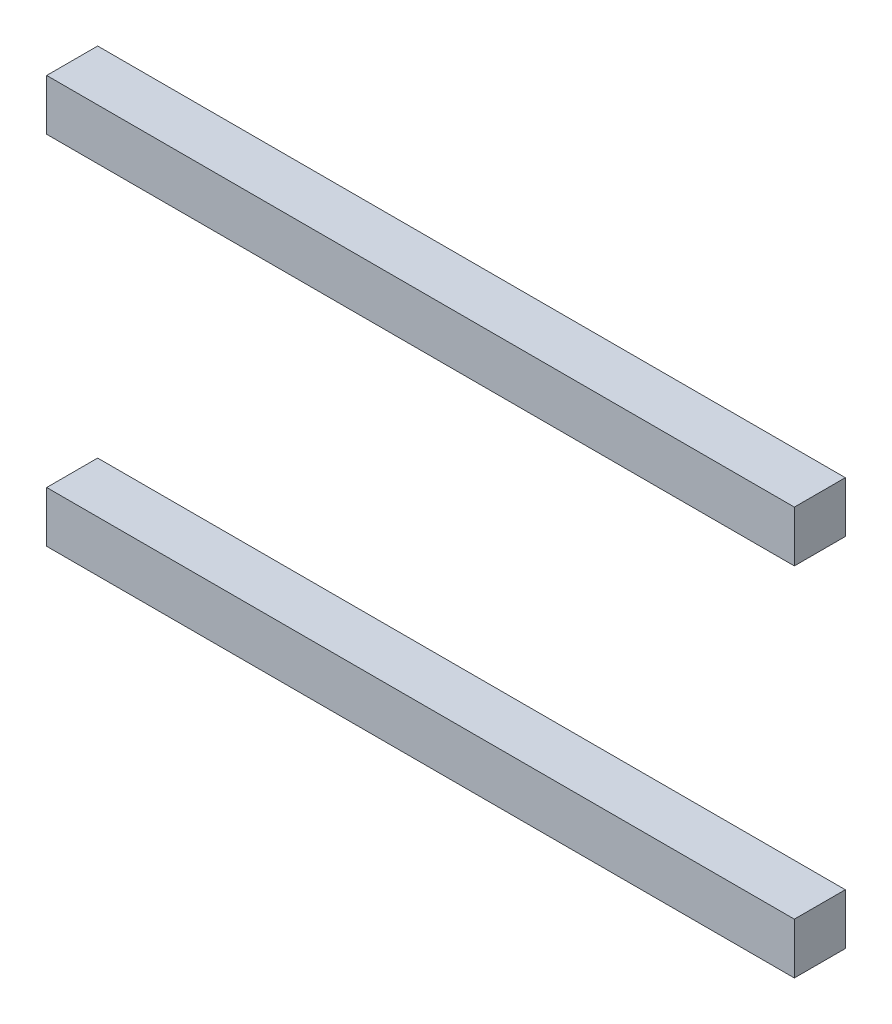
ISO-10303-21;
HEADER;
FILE_DESCRIPTION(('STEP AP214'),'2;1');
FILE_NAME('part.step','',(''),(''),'','','');
FILE_SCHEMA(('AUTOMOTIVE_DESIGN { 1 0 10303 214 1 1 1 1 }'));
ENDSEC;
DATA;
#1=APPLICATION_CONTEXT('core data for automotive mechanical design processes');
#2=APPLICATION_PROTOCOL_DEFINITION('international standard','automotive_design',2000,#1);
#3=PRODUCT_CONTEXT('',#1,'mechanical');
#4=PRODUCT('Part','Part','',(#3));
#5=PRODUCT_RELATED_PRODUCT_CATEGORY('part','',(#4));
#6=PRODUCT_DEFINITION_FORMATION('','',#4);
#7=PRODUCT_DEFINITION_CONTEXT('part definition',#1,'design');
#8=PRODUCT_DEFINITION('design','',#6,#7);
#9=PRODUCT_DEFINITION_SHAPE('','',#8);
#10=(LENGTH_UNIT() NAMED_UNIT(*) SI_UNIT(.MILLI.,.METRE.));
#11=(NAMED_UNIT(*) PLANE_ANGLE_UNIT() SI_UNIT($,.RADIAN.));
#12=(NAMED_UNIT(*) SI_UNIT($,.STERADIAN.) SOLID_ANGLE_UNIT());
#13=UNCERTAINTY_MEASURE_WITH_UNIT(LENGTH_MEASURE(1.E-05),#10,'distance_accuracy_value','');
#14=(GEOMETRIC_REPRESENTATION_CONTEXT(3) GLOBAL_UNCERTAINTY_ASSIGNED_CONTEXT((#13)) GLOBAL_UNIT_ASSIGNED_CONTEXT((#10,
#11,#12)) REPRESENTATION_CONTEXT('',''));
#15=CARTESIAN_POINT('',(0.,0.,0.));
#16=DIRECTION('',(0.,0.,1.));
#17=DIRECTION('',(1.,0.,0.));
#18=AXIS2_PLACEMENT_3D('',#15,#16,#17);
#19=CARTESIAN_POINT('',(-165.608108108108,-117.635135135135,30.));
#20=DIRECTION('',(1.,0.,0.));
#21=DIRECTION('',(0.,0.,-1.));
#22=AXIS2_PLACEMENT_3D('',#19,#20,#21);
#23=PLANE('',#22);
#24=DIRECTION('',(0.,-1.,0.));
#25=VECTOR('',#24,1.);
#26=CARTESIAN_POINT('',(-165.608108108108,-117.635135135135,0.));
#27=LINE('',#26,#25);
#28=CARTESIAN_POINT('',(-165.608108108108,-117.635135135135,0.));
#29=VERTEX_POINT('',#28);
#30=CARTESIAN_POINT('',(-165.608108108108,-147.635135135135,0.));
#31=VERTEX_POINT('',#30);
#32=EDGE_CURVE('E12',#29,#31,#27,.T.);
#33=ORIENTED_EDGE('',*,*,#32,.T.);
#34=DIRECTION('',(0.,0.,-1.));
#35=VECTOR('',#34,1.);
#36=CARTESIAN_POINT('',(-165.608108108108,-147.635135135135,30.));
#37=LINE('',#36,#35);
#38=CARTESIAN_POINT('',(-165.608108108108,-147.635135135135,30.));
#39=VERTEX_POINT('',#38);
#40=EDGE_CURVE('E133',#39,#31,#37,.T.);
#41=ORIENTED_EDGE('',*,*,#40,.F.);
#42=DIRECTION('',(0.,-1.,0.));
#43=VECTOR('',#42,1.);
#44=CARTESIAN_POINT('',(-165.608108108108,-117.635135135135,30.));
#45=LINE('',#44,#43);
#46=CARTESIAN_POINT('',(-165.608108108108,-117.635135135135,30.));
#47=VERTEX_POINT('',#46);
#48=EDGE_CURVE('E57',#47,#39,#45,.T.);
#49=ORIENTED_EDGE('',*,*,#48,.F.);
#50=DIRECTION('',(0.,0.,-1.));
#51=VECTOR('',#50,1.);
#52=CARTESIAN_POINT('',(-165.608108108108,-117.635135135135,30.));
#53=LINE('',#52,#51);
#54=EDGE_CURVE('E115',#47,#29,#53,.T.);
#55=ORIENTED_EDGE('',*,*,#54,.T.);
#56=EDGE_LOOP('',(#33,#41,#49,#55));
#57=FACE_BOUND('',#56,.T.);
#58=ADVANCED_FACE('F53',(#57),#23,.F.);
#59=CARTESIAN_POINT('',(-165.608108108108,-147.635135135135,30.));
#60=DIRECTION('',(0.,1.,0.));
#61=DIRECTION('',(0.,0.,1.));
#62=AXIS2_PLACEMENT_3D('',#59,#60,#61);
#63=PLANE('',#62);
#64=DIRECTION('',(1.,0.,0.));
#65=VECTOR('',#64,1.);
#66=CARTESIAN_POINT('',(-165.608108108108,-147.635135135135,0.));
#67=LINE('',#66,#65);
#68=CARTESIAN_POINT('',(274.391891891892,-147.635135135135,0.));
#69=VERTEX_POINT('',#68);
#70=EDGE_CURVE('E64',#31,#69,#67,.T.);
#71=ORIENTED_EDGE('',*,*,#70,.T.);
#72=DIRECTION('',(0.,0.,-1.));
#73=VECTOR('',#72,1.);
#74=CARTESIAN_POINT('',(274.391891891892,-147.635135135135,30.));
#75=LINE('',#74,#73);
#76=CARTESIAN_POINT('',(274.391891891892,-147.635135135135,30.));
#77=VERTEX_POINT('',#76);
#78=EDGE_CURVE('E109',#77,#69,#75,.T.);
#79=ORIENTED_EDGE('',*,*,#78,.F.);
#80=DIRECTION('',(1.,0.,0.));
#81=VECTOR('',#80,1.);
#82=CARTESIAN_POINT('',(-165.608108108108,-147.635135135135,30.));
#83=LINE('',#82,#81);
#84=EDGE_CURVE('E88',#39,#77,#83,.T.);
#85=ORIENTED_EDGE('',*,*,#84,.F.);
#86=ORIENTED_EDGE('',*,*,#40,.T.);
#87=EDGE_LOOP('',(#71,#79,#85,#86));
#88=FACE_BOUND('',#87,.T.);
#89=ADVANCED_FACE('F137',(#88),#63,.F.);
#90=CARTESIAN_POINT('',(274.391891891892,-117.635135135135,30.));
#91=DIRECTION('',(-1.,0.,0.));
#92=DIRECTION('',(0.,-1.,0.));
#93=AXIS2_PLACEMENT_3D('',#90,#91,#92);
#94=PLANE('',#93);
#95=DIRECTION('',(0.,1.,0.));
#96=VECTOR('',#95,1.);
#97=CARTESIAN_POINT('',(274.391891891892,-117.635135135135,0.));
#98=LINE('',#97,#96);
#99=CARTESIAN_POINT('',(274.391891891892,-117.635135135135,0.));
#100=VERTEX_POINT('',#99);
#101=EDGE_CURVE('E104',#69,#100,#98,.T.);
#102=ORIENTED_EDGE('',*,*,#101,.T.);
#103=DIRECTION('',(0.,0.,-1.));
#104=VECTOR('',#103,1.);
#105=CARTESIAN_POINT('',(274.391891891892,-117.635135135135,30.));
#106=LINE('',#105,#104);
#107=CARTESIAN_POINT('',(274.391891891892,-117.635135135135,30.));
#108=VERTEX_POINT('',#107);
#109=EDGE_CURVE('E107',#108,#100,#106,.T.);
#110=ORIENTED_EDGE('',*,*,#109,.F.);
#111=DIRECTION('',(0.,1.,0.));
#112=VECTOR('',#111,1.);
#113=CARTESIAN_POINT('',(274.391891891892,-117.635135135135,30.));
#114=LINE('',#113,#112);
#115=EDGE_CURVE('E127',#77,#108,#114,.T.);
#116=ORIENTED_EDGE('',*,*,#115,.F.);
#117=ORIENTED_EDGE('',*,*,#78,.T.);
#118=EDGE_LOOP('',(#102,#110,#116,#117));
#119=FACE_BOUND('',#118,.T.);
#120=ADVANCED_FACE('F105',(#119),#94,.F.);
#121=CARTESIAN_POINT('',(-165.608108108108,-117.635135135135,30.));
#122=DIRECTION('',(0.,-1.,0.));
#123=DIRECTION('',(0.,0.,-1.));
#124=AXIS2_PLACEMENT_3D('',#121,#122,#123);
#125=PLANE('',#124);
#126=DIRECTION('',(-1.,0.,0.));
#127=VECTOR('',#126,1.);
#128=CARTESIAN_POINT('',(-165.608108108108,-117.635135135135,0.));
#129=LINE('',#128,#127);
#130=EDGE_CURVE('E98',#100,#29,#129,.T.);
#131=ORIENTED_EDGE('',*,*,#130,.T.);
#132=ORIENTED_EDGE('',*,*,#54,.F.);
#133=DIRECTION('',(-1.,0.,0.));
#134=VECTOR('',#133,1.);
#135=CARTESIAN_POINT('',(-165.608108108108,-117.635135135135,30.));
#136=LINE('',#135,#134);
#137=EDGE_CURVE('E113',#108,#47,#136,.T.);
#138=ORIENTED_EDGE('',*,*,#137,.F.);
#139=ORIENTED_EDGE('',*,*,#109,.T.);
#140=EDGE_LOOP('',(#131,#132,#138,#139));
#141=FACE_BOUND('',#140,.T.);
#142=ADVANCED_FACE('F112',(#141),#125,.F.);
#143=CARTESIAN_POINT('',(0.,0.,30.));
#144=DIRECTION('',(0.,0.,1.));
#145=DIRECTION('',(1.,0.,0.));
#146=AXIS2_PLACEMENT_3D('',#143,#144,#145);
#147=PLANE('',#146);
#148=ORIENTED_EDGE('',*,*,#48,.T.);
#149=ORIENTED_EDGE('',*,*,#84,.T.);
#150=ORIENTED_EDGE('',*,*,#115,.T.);
#151=ORIENTED_EDGE('',*,*,#137,.T.);
#152=EDGE_LOOP('',(#148,#149,#150,#151));
#153=FACE_BOUND('',#152,.T.);
#154=ADVANCED_FACE('F55',(#153),#147,.T.);
#155=CARTESIAN_POINT('',(0.,0.,0.));
#156=DIRECTION('',(0.,0.,1.));
#157=DIRECTION('',(1.,0.,0.));
#158=AXIS2_PLACEMENT_3D('',#155,#156,#157);
#159=PLANE('',#158);
#160=ORIENTED_EDGE('',*,*,#32,.F.);
#161=ORIENTED_EDGE('',*,*,#130,.F.);
#162=ORIENTED_EDGE('',*,*,#101,.F.);
#163=ORIENTED_EDGE('',*,*,#70,.F.);
#164=EDGE_LOOP('',(#160,#161,#162,#163));
#165=FACE_BOUND('',#164,.T.);
#166=ADVANCED_FACE('F117',(#165),#159,.F.);
#167=CLOSED_SHELL('',(#58,#89,#120,#142,#154,#166));
#168=MANIFOLD_SOLID_BREP('B2',#167);
#169=CARTESIAN_POINT('',(-165.608108108108,92.3648648648649,30.));
#170=DIRECTION('',(1.,0.,0.));
#171=DIRECTION('',(0.,0.,-1.));
#172=AXIS2_PLACEMENT_3D('',#169,#170,#171);
#173=PLANE('',#172);
#174=DIRECTION('',(0.,-1.,0.));
#175=VECTOR('',#174,1.);
#176=CARTESIAN_POINT('',(-165.608108108108,92.3648648648649,0.));
#177=LINE('',#176,#175);
#178=CARTESIAN_POINT('',(-165.608108108108,92.3648648648649,0.));
#179=VERTEX_POINT('',#178);
#180=CARTESIAN_POINT('',(-165.608108108108,62.3648648648648,0.));
#181=VERTEX_POINT('',#180);
#182=EDGE_CURVE('E264',#179,#181,#177,.T.);
#183=ORIENTED_EDGE('',*,*,#182,.T.);
#184=DIRECTION('',(0.,0.,-1.));
#185=VECTOR('',#184,1.);
#186=CARTESIAN_POINT('',(-165.608108108108,62.3648648648648,30.));
#187=LINE('',#186,#185);
#188=CARTESIAN_POINT('',(-165.608108108108,62.3648648648648,30.));
#189=VERTEX_POINT('',#188);
#190=EDGE_CURVE('E51',#189,#181,#187,.T.);
#191=ORIENTED_EDGE('',*,*,#190,.F.);
#192=DIRECTION('',(0.,-1.,0.));
#193=VECTOR('',#192,1.);
#194=CARTESIAN_POINT('',(-165.608108108108,92.3648648648649,30.));
#195=LINE('',#194,#193);
#196=CARTESIAN_POINT('',(-165.608108108108,92.3648648648649,30.));
#197=VERTEX_POINT('',#196);
#198=EDGE_CURVE('E252',#197,#189,#195,.T.);
#199=ORIENTED_EDGE('',*,*,#198,.F.);
#200=DIRECTION('',(0.,0.,-1.));
#201=VECTOR('',#200,1.);
#202=CARTESIAN_POINT('',(-165.608108108108,92.3648648648649,30.));
#203=LINE('',#202,#201);
#204=EDGE_CURVE('E260',#197,#179,#203,.T.);
#205=ORIENTED_EDGE('',*,*,#204,.T.);
#206=EDGE_LOOP('',(#183,#191,#199,#205));
#207=FACE_BOUND('',#206,.T.);
#208=ADVANCED_FACE('F201',(#207),#173,.F.);
#209=CARTESIAN_POINT('',(-165.608108108108,62.3648648648648,30.));
#210=DIRECTION('',(0.,1.,0.));
#211=DIRECTION('',(0.,0.,1.));
#212=AXIS2_PLACEMENT_3D('',#209,#210,#211);
#213=PLANE('',#212);
#214=DIRECTION('',(1.,0.,0.));
#215=VECTOR('',#214,1.);
#216=CARTESIAN_POINT('',(-165.608108108108,62.3648648648648,0.));
#217=LINE('',#216,#215);
#218=CARTESIAN_POINT('',(274.391891891892,62.3648648648648,0.));
#219=VERTEX_POINT('',#218);
#220=EDGE_CURVE('E256',#181,#219,#217,.T.);
#221=ORIENTED_EDGE('',*,*,#220,.T.);
#222=DIRECTION('',(0.,0.,-1.));
#223=VECTOR('',#222,1.);
#224=CARTESIAN_POINT('',(274.391891891892,62.3648648648648,30.));
#225=LINE('',#224,#223);
#226=CARTESIAN_POINT('',(274.391891891892,62.3648648648648,30.));
#227=VERTEX_POINT('',#226);
#228=EDGE_CURVE('E209',#227,#219,#225,.T.);
#229=ORIENTED_EDGE('',*,*,#228,.F.);
#230=DIRECTION('',(1.,0.,0.));
#231=VECTOR('',#230,1.);
#232=CARTESIAN_POINT('',(-165.608108108108,62.3648648648648,30.));
#233=LINE('',#232,#231);
#234=EDGE_CURVE('E247',#189,#227,#233,.T.);
#235=ORIENTED_EDGE('',*,*,#234,.F.);
#236=ORIENTED_EDGE('',*,*,#190,.T.);
#237=EDGE_LOOP('',(#221,#229,#235,#236));
#238=FACE_BOUND('',#237,.T.);
#239=ADVANCED_FACE('F255',(#238),#213,.F.);
#240=CARTESIAN_POINT('',(274.391891891892,92.3648648648649,30.));
#241=DIRECTION('',(-1.,0.,0.));
#242=DIRECTION('',(0.,0.,1.));
#243=AXIS2_PLACEMENT_3D('',#240,#241,#242);
#244=PLANE('',#243);
#245=DIRECTION('',(0.,1.,0.));
#246=VECTOR('',#245,1.);
#247=CARTESIAN_POINT('',(274.391891891892,92.3648648648649,0.));
#248=LINE('',#247,#246);
#249=CARTESIAN_POINT('',(274.391891891892,92.3648648648649,0.));
#250=VERTEX_POINT('',#249);
#251=EDGE_CURVE('E234',#219,#250,#248,.T.);
#252=ORIENTED_EDGE('',*,*,#251,.T.);
#253=DIRECTION('',(0.,0.,-1.));
#254=VECTOR('',#253,1.);
#255=CARTESIAN_POINT('',(274.391891891892,92.3648648648649,30.));
#256=LINE('',#255,#254);
#257=CARTESIAN_POINT('',(274.391891891892,92.3648648648649,30.));
#258=VERTEX_POINT('',#257);
#259=EDGE_CURVE('E257',#258,#250,#256,.T.);
#260=ORIENTED_EDGE('',*,*,#259,.F.);
#261=DIRECTION('',(0.,1.,0.));
#262=VECTOR('',#261,1.);
#263=CARTESIAN_POINT('',(274.391891891892,92.3648648648649,30.));
#264=LINE('',#263,#262);
#265=EDGE_CURVE('E250',#227,#258,#264,.T.);
#266=ORIENTED_EDGE('',*,*,#265,.F.);
#267=ORIENTED_EDGE('',*,*,#228,.T.);
#268=EDGE_LOOP('',(#252,#260,#266,#267));
#269=FACE_BOUND('',#268,.T.);
#270=ADVANCED_FACE('F258',(#269),#244,.F.);
#271=CARTESIAN_POINT('',(-165.608108108108,92.3648648648649,30.));
#272=DIRECTION('',(0.,-1.,0.));
#273=DIRECTION('',(0.,0.,-1.));
#274=AXIS2_PLACEMENT_3D('',#271,#272,#273);
#275=PLANE('',#274);
#276=DIRECTION('',(-1.,0.,0.));
#277=VECTOR('',#276,1.);
#278=CARTESIAN_POINT('',(-165.608108108108,92.3648648648649,0.));
#279=LINE('',#278,#277);
#280=EDGE_CURVE('E240',#250,#179,#279,.T.);
#281=ORIENTED_EDGE('',*,*,#280,.T.);
#282=ORIENTED_EDGE('',*,*,#204,.F.);
#283=DIRECTION('',(-1.,0.,0.));
#284=VECTOR('',#283,1.);
#285=CARTESIAN_POINT('',(-165.608108108108,92.3648648648649,30.));
#286=LINE('',#285,#284);
#287=EDGE_CURVE('E217',#258,#197,#286,.T.);
#288=ORIENTED_EDGE('',*,*,#287,.F.);
#289=ORIENTED_EDGE('',*,*,#259,.T.);
#290=EDGE_LOOP('',(#281,#282,#288,#289));
#291=FACE_BOUND('',#290,.T.);
#292=ADVANCED_FACE('F271',(#291),#275,.F.);
#293=CARTESIAN_POINT('',(0.,0.,30.));
#294=DIRECTION('',(0.,0.,1.));
#295=DIRECTION('',(1.,0.,0.));
#296=AXIS2_PLACEMENT_3D('',#293,#294,#295);
#297=PLANE('',#296);
#298=ORIENTED_EDGE('',*,*,#198,.T.);
#299=ORIENTED_EDGE('',*,*,#234,.T.);
#300=ORIENTED_EDGE('',*,*,#265,.T.);
#301=ORIENTED_EDGE('',*,*,#287,.T.);
#302=EDGE_LOOP('',(#298,#299,#300,#301));
#303=FACE_BOUND('',#302,.T.);
#304=ADVANCED_FACE('F248',(#303),#297,.T.);
#305=CARTESIAN_POINT('',(0.,0.,0.));
#306=DIRECTION('',(0.,0.,1.));
#307=DIRECTION('',(1.,0.,0.));
#308=AXIS2_PLACEMENT_3D('',#305,#306,#307);
#309=PLANE('',#308);
#310=ORIENTED_EDGE('',*,*,#182,.F.);
#311=ORIENTED_EDGE('',*,*,#280,.F.);
#312=ORIENTED_EDGE('',*,*,#251,.F.);
#313=ORIENTED_EDGE('',*,*,#220,.F.);
#314=EDGE_LOOP('',(#310,#311,#312,#313));
#315=FACE_BOUND('',#314,.T.);
#316=ADVANCED_FACE('F274',(#315),#309,.F.);
#317=CLOSED_SHELL('',(#208,#239,#270,#292,#304,#316));
#318=MANIFOLD_SOLID_BREP('B6',#317);
#319=ADVANCED_BREP_SHAPE_REPRESENTATION('',(#18,#168,#318),#14);
#320=SHAPE_DEFINITION_REPRESENTATION(#9,#319);
ENDSEC;
END-ISO-10303-21;
